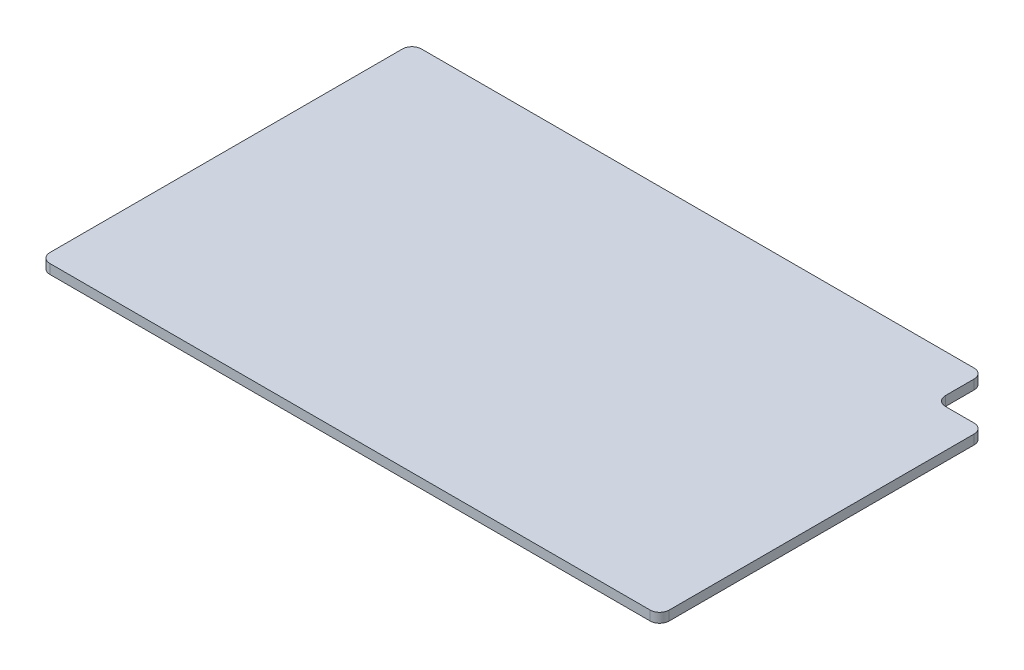
ISO-10303-21;
HEADER;
FILE_DESCRIPTION(('STEP AP214'),'2;1');
FILE_NAME('part.step','',(''),(''),'','','');
FILE_SCHEMA(('AUTOMOTIVE_DESIGN { 1 0 10303 214 1 1 1 1 }'));
ENDSEC;
DATA;
#1=APPLICATION_CONTEXT('core data for automotive mechanical design processes');
#2=APPLICATION_PROTOCOL_DEFINITION('international standard','automotive_design',2000,#1);
#3=PRODUCT_CONTEXT('',#1,'mechanical');
#4=PRODUCT('Part','Part','',(#3));
#5=PRODUCT_RELATED_PRODUCT_CATEGORY('part','',(#4));
#6=PRODUCT_DEFINITION_FORMATION('','',#4);
#7=PRODUCT_DEFINITION_CONTEXT('part definition',#1,'design');
#8=PRODUCT_DEFINITION('design','',#6,#7);
#9=PRODUCT_DEFINITION_SHAPE('','',#8);
#10=(LENGTH_UNIT() NAMED_UNIT(*) SI_UNIT(.MILLI.,.METRE.));
#11=(NAMED_UNIT(*) PLANE_ANGLE_UNIT() SI_UNIT($,.RADIAN.));
#12=(NAMED_UNIT(*) SI_UNIT($,.STERADIAN.) SOLID_ANGLE_UNIT());
#13=UNCERTAINTY_MEASURE_WITH_UNIT(LENGTH_MEASURE(1.E-05),#10,'distance_accuracy_value','');
#14=(GEOMETRIC_REPRESENTATION_CONTEXT(3) GLOBAL_UNCERTAINTY_ASSIGNED_CONTEXT((#13)) GLOBAL_UNIT_ASSIGNED_CONTEXT((#10,
#11,#12)) REPRESENTATION_CONTEXT('',''));
#15=CARTESIAN_POINT('',(0.,0.,0.));
#16=DIRECTION('',(0.,0.,1.));
#17=DIRECTION('',(1.,0.,0.));
#18=AXIS2_PLACEMENT_3D('',#15,#16,#17);
#19=CARTESIAN_POINT('',(20.8916831414113,5.48934040957227,79.2905391030123));
#20=DIRECTION('',(0.,0.,-1.));
#21=DIRECTION('',(-1.,0.,0.));
#22=AXIS2_PLACEMENT_3D('',#19,#20,#21);
#23=PLANE('',#22);
#24=DIRECTION('',(1.,0.,0.));
#25=VECTOR('',#24,1.);
#26=CARTESIAN_POINT('',(20.8916831414113,5.48934040957227,79.2905391030123));
#27=LINE('',#26,#25);
#28=CARTESIAN_POINT('',(-43.1083168585887,5.48934040957227,79.2905391030123));
#29=VERTEX_POINT('',#28);
#30=CARTESIAN_POINT('',(19.8916831414113,5.48934040957227,79.2905391030123));
#31=VERTEX_POINT('',#30);
#32=EDGE_CURVE('E172',#29,#31,#27,.T.);
#33=ORIENTED_EDGE('',*,*,#32,.F.);
#34=DIRECTION('',(0.,-1.,0.));
#35=VECTOR('',#34,1.);
#36=CARTESIAN_POINT('',(-43.1083168585887,5.48934040957227,79.2905391030123));
#37=LINE('',#36,#35);
#38=CARTESIAN_POINT('',(-43.1083168585887,4.48934040957227,79.2905391030123));
#39=VERTEX_POINT('',#38);
#40=EDGE_CURVE('E212',#29,#39,#37,.T.);
#41=ORIENTED_EDGE('',*,*,#40,.T.);
#42=DIRECTION('',(1.,0.,0.));
#43=VECTOR('',#42,1.);
#44=CARTESIAN_POINT('',(20.8916831414113,4.48934040957227,79.2905391030123));
#45=LINE('',#44,#43);
#46=CARTESIAN_POINT('',(19.8916831414113,4.48934040957227,79.2905391030123));
#47=VERTEX_POINT('',#46);
#48=EDGE_CURVE('E158',#39,#47,#45,.T.);
#49=ORIENTED_EDGE('',*,*,#48,.T.);
#50=DIRECTION('',(0.,-1.,0.));
#51=VECTOR('',#50,1.);
#52=CARTESIAN_POINT('',(19.8916831414113,5.48934040957227,79.2905391030123));
#53=LINE('',#52,#51);
#54=EDGE_CURVE('E141',#47,#31,#53,.F.);
#55=ORIENTED_EDGE('',*,*,#54,.T.);
#56=EDGE_LOOP('',(#33,#41,#49,#55));
#57=FACE_BOUND('',#56,.T.);
#58=ADVANCED_FACE('F45',(#57),#23,.F.);
#59=CARTESIAN_POINT('',(20.8916831414113,5.48934040957227,45.2905391030123));
#60=DIRECTION('',(-1.,0.,0.));
#61=DIRECTION('',(0.,0.,1.));
#62=AXIS2_PLACEMENT_3D('',#59,#60,#61);
#63=PLANE('',#62);
#64=DIRECTION('',(0.,0.,-1.));
#65=VECTOR('',#64,1.);
#66=CARTESIAN_POINT('',(20.8916831414113,4.48934040957227,45.2905391030123));
#67=LINE('',#66,#65);
#68=CARTESIAN_POINT('',(20.8916831414113,4.48934040957227,78.2905391030123));
#69=VERTEX_POINT('',#68);
#70=CARTESIAN_POINT('',(20.8916831414113,4.48934040957227,46.2905391030123));
#71=VERTEX_POINT('',#70);
#72=EDGE_CURVE('E148',#69,#71,#67,.T.);
#73=ORIENTED_EDGE('',*,*,#72,.T.);
#74=DIRECTION('',(0.,-1.,0.));
#75=VECTOR('',#74,1.);
#76=CARTESIAN_POINT('',(20.8916831414113,5.48934040957227,46.2905391030123));
#77=LINE('',#76,#75);
#78=CARTESIAN_POINT('',(20.8916831414113,5.48934040957227,46.2905391030123));
#79=VERTEX_POINT('',#78);
#80=EDGE_CURVE('E197',#71,#79,#77,.F.);
#81=ORIENTED_EDGE('',*,*,#80,.T.);
#82=DIRECTION('',(0.,0.,-1.));
#83=VECTOR('',#82,1.);
#84=CARTESIAN_POINT('',(20.8916831414113,5.48934040957227,45.2905391030123));
#85=LINE('',#84,#83);
#86=CARTESIAN_POINT('',(20.8916831414113,5.48934040957227,78.2905391030123));
#87=VERTEX_POINT('',#86);
#88=EDGE_CURVE('E151',#87,#79,#85,.T.);
#89=ORIENTED_EDGE('',*,*,#88,.F.);
#90=DIRECTION('',(0.,-1.,0.));
#91=VECTOR('',#90,1.);
#92=CARTESIAN_POINT('',(20.8916831414113,5.48934040957227,78.2905391030123));
#93=LINE('',#92,#91);
#94=EDGE_CURVE('E139',#87,#69,#93,.T.);
#95=ORIENTED_EDGE('',*,*,#94,.T.);
#96=EDGE_LOOP('',(#73,#81,#89,#95));
#97=FACE_BOUND('',#96,.T.);
#98=ADVANCED_FACE('F147',(#97),#63,.F.);
#99=CARTESIAN_POINT('',(15.8916831414113,5.48934040957227,45.2905391030123));
#100=DIRECTION('',(0.,0.,1.));
#101=DIRECTION('',(1.,0.,0.));
#102=AXIS2_PLACEMENT_3D('',#99,#100,#101);
#103=PLANE('',#102);
#104=DIRECTION('',(-1.,0.,0.));
#105=VECTOR('',#104,1.);
#106=CARTESIAN_POINT('',(15.8916831414113,4.48934040957227,45.2905391030123));
#107=LINE('',#106,#105);
#108=CARTESIAN_POINT('',(19.8916831414113,4.48934040957227,45.2905391030123));
#109=VERTEX_POINT('',#108);
#110=CARTESIAN_POINT('',(16.8916831414113,4.48934040957227,45.2905391030123));
#111=VERTEX_POINT('',#110);
#112=EDGE_CURVE('E157',#109,#111,#107,.T.);
#113=ORIENTED_EDGE('',*,*,#112,.T.);
#114=DIRECTION('',(0.,-1.,0.));
#115=VECTOR('',#114,1.);
#116=CARTESIAN_POINT('',(16.8916831414113,5.48934040957227,45.2905391030123));
#117=LINE('',#116,#115);
#118=CARTESIAN_POINT('',(16.8916831414113,5.48934040957227,45.2905391030123));
#119=VERTEX_POINT('',#118);
#120=EDGE_CURVE('E195',#111,#119,#117,.F.);
#121=ORIENTED_EDGE('',*,*,#120,.T.);
#122=DIRECTION('',(-1.,0.,0.));
#123=VECTOR('',#122,1.);
#124=CARTESIAN_POINT('',(15.8916831414113,5.48934040957227,45.2905391030123));
#125=LINE('',#124,#123);
#126=CARTESIAN_POINT('',(19.8916831414113,5.48934040957227,45.2905391030123));
#127=VERTEX_POINT('',#126);
#128=EDGE_CURVE('E231',#127,#119,#125,.T.);
#129=ORIENTED_EDGE('',*,*,#128,.F.);
#130=DIRECTION('',(0.,-1.,0.));
#131=VECTOR('',#130,1.);
#132=CARTESIAN_POINT('',(19.8916831414113,5.48934040957227,45.2905391030123));
#133=LINE('',#132,#131);
#134=EDGE_CURVE('E192',#127,#109,#133,.T.);
#135=ORIENTED_EDGE('',*,*,#134,.T.);
#136=EDGE_LOOP('',(#113,#121,#129,#135));
#137=FACE_BOUND('',#136,.T.);
#138=ADVANCED_FACE('F241',(#137),#103,.F.);
#139=CARTESIAN_POINT('',(15.8916831414113,5.48934040957227,40.2905391030123));
#140=DIRECTION('',(-1.,0.,0.));
#141=DIRECTION('',(0.,0.,1.));
#142=AXIS2_PLACEMENT_3D('',#139,#140,#141);
#143=PLANE('',#142);
#144=DIRECTION('',(0.,0.,-1.));
#145=VECTOR('',#144,1.);
#146=CARTESIAN_POINT('',(15.8916831414113,4.48934040957227,40.2905391030123));
#147=LINE('',#146,#145);
#148=CARTESIAN_POINT('',(15.8916831414113,4.48934040957227,44.2905391030123));
#149=VERTEX_POINT('',#148);
#150=CARTESIAN_POINT('',(15.8916831414113,4.48934040957227,41.2905391030123));
#151=VERTEX_POINT('',#150);
#152=EDGE_CURVE('E161',#149,#151,#147,.T.);
#153=ORIENTED_EDGE('',*,*,#152,.T.);
#154=DIRECTION('',(0.,-1.,0.));
#155=VECTOR('',#154,1.);
#156=CARTESIAN_POINT('',(15.8916831414113,5.48934040957227,41.2905391030123));
#157=LINE('',#156,#155);
#158=CARTESIAN_POINT('',(15.8916831414113,5.48934040957227,41.2905391030123));
#159=VERTEX_POINT('',#158);
#160=EDGE_CURVE('E186',#151,#159,#157,.F.);
#161=ORIENTED_EDGE('',*,*,#160,.T.);
#162=DIRECTION('',(0.,0.,-1.));
#163=VECTOR('',#162,1.);
#164=CARTESIAN_POINT('',(15.8916831414113,5.48934040957227,40.2905391030123));
#165=LINE('',#164,#163);
#166=CARTESIAN_POINT('',(15.8916831414113,5.48934040957227,44.2905391030123));
#167=VERTEX_POINT('',#166);
#168=EDGE_CURVE('E226',#167,#159,#165,.T.);
#169=ORIENTED_EDGE('',*,*,#168,.F.);
#170=DIRECTION('',(0.,-1.,0.));
#171=VECTOR('',#170,1.);
#172=CARTESIAN_POINT('',(15.8916831414113,4.48934040957227,44.2905391030123));
#173=LINE('',#172,#171);
#174=EDGE_CURVE('E183',#167,#149,#173,.T.);
#175=ORIENTED_EDGE('',*,*,#174,.T.);
#176=EDGE_LOOP('',(#153,#161,#169,#175));
#177=FACE_BOUND('',#176,.T.);
#178=ADVANCED_FACE('F250',(#177),#143,.F.);
#179=CARTESIAN_POINT('',(-44.1083168585887,5.48934040957227,40.2905391030123));
#180=DIRECTION('',(0.,0.,1.));
#181=DIRECTION('',(1.,0.,0.));
#182=AXIS2_PLACEMENT_3D('',#179,#180,#181);
#183=PLANE('',#182);
#184=DIRECTION('',(-1.,0.,0.));
#185=VECTOR('',#184,1.);
#186=CARTESIAN_POINT('',(-44.1083168585887,4.48934040957227,40.2905391030123));
#187=LINE('',#186,#185);
#188=CARTESIAN_POINT('',(14.8916831414113,4.48934040957227,40.2905391030123));
#189=VERTEX_POINT('',#188);
#190=CARTESIAN_POINT('',(-43.1083168585887,4.48934040957227,40.2905391030123));
#191=VERTEX_POINT('',#190);
#192=EDGE_CURVE('E168',#189,#191,#187,.T.);
#193=ORIENTED_EDGE('',*,*,#192,.T.);
#194=DIRECTION('',(0.,-1.,0.));
#195=VECTOR('',#194,1.);
#196=CARTESIAN_POINT('',(-43.1083168585887,5.48934040957227,40.2905391030123));
#197=LINE('',#196,#195);
#198=CARTESIAN_POINT('',(-43.1083168585887,5.48934040957227,40.2905391030123));
#199=VERTEX_POINT('',#198);
#200=EDGE_CURVE('E208',#191,#199,#197,.F.);
#201=ORIENTED_EDGE('',*,*,#200,.T.);
#202=DIRECTION('',(-1.,0.,0.));
#203=VECTOR('',#202,1.);
#204=CARTESIAN_POINT('',(-44.1083168585887,5.48934040957227,40.2905391030123));
#205=LINE('',#204,#203);
#206=CARTESIAN_POINT('',(14.8916831414113,5.48934040957227,40.2905391030123));
#207=VERTEX_POINT('',#206);
#208=EDGE_CURVE('E225',#207,#199,#205,.T.);
#209=ORIENTED_EDGE('',*,*,#208,.F.);
#210=DIRECTION('',(0.,-1.,0.));
#211=VECTOR('',#210,1.);
#212=CARTESIAN_POINT('',(14.8916831414113,5.48934040957227,40.2905391030123));
#213=LINE('',#212,#211);
#214=EDGE_CURVE('E177',#207,#189,#213,.T.);
#215=ORIENTED_EDGE('',*,*,#214,.T.);
#216=EDGE_LOOP('',(#193,#201,#209,#215));
#217=FACE_BOUND('',#216,.T.);
#218=ADVANCED_FACE('F259',(#217),#183,.F.);
#219=CARTESIAN_POINT('',(-44.1083168585887,5.48934040957227,79.2905391030123));
#220=DIRECTION('',(1.,0.,0.));
#221=DIRECTION('',(0.,0.,-1.));
#222=AXIS2_PLACEMENT_3D('',#219,#220,#221);
#223=PLANE('',#222);
#224=DIRECTION('',(0.,0.,1.));
#225=VECTOR('',#224,1.);
#226=CARTESIAN_POINT('',(-44.1083168585887,4.48934040957227,79.2905391030123));
#227=LINE('',#226,#225);
#228=CARTESIAN_POINT('',(-44.1083168585887,4.48934040957227,41.2905391030123));
#229=VERTEX_POINT('',#228);
#230=CARTESIAN_POINT('',(-44.1083168585887,4.48934040957227,78.2905391030123));
#231=VERTEX_POINT('',#230);
#232=EDGE_CURVE('E171',#229,#231,#227,.T.);
#233=ORIENTED_EDGE('',*,*,#232,.T.);
#234=DIRECTION('',(0.,-1.,0.));
#235=VECTOR('',#234,1.);
#236=CARTESIAN_POINT('',(-44.1083168585887,5.48934040957227,78.2905391030123));
#237=LINE('',#236,#235);
#238=CARTESIAN_POINT('',(-44.1083168585887,5.48934040957227,78.2905391030123));
#239=VERTEX_POINT('',#238);
#240=EDGE_CURVE('E53',#231,#239,#237,.F.);
#241=ORIENTED_EDGE('',*,*,#240,.T.);
#242=DIRECTION('',(0.,0.,1.));
#243=VECTOR('',#242,1.);
#244=CARTESIAN_POINT('',(-44.1083168585887,5.48934040957227,79.2905391030123));
#245=LINE('',#244,#243);
#246=CARTESIAN_POINT('',(-44.1083168585887,5.48934040957227,41.2905391030123));
#247=VERTEX_POINT('',#246);
#248=EDGE_CURVE('E152',#247,#239,#245,.T.);
#249=ORIENTED_EDGE('',*,*,#248,.F.);
#250=DIRECTION('',(0.,-1.,0.));
#251=VECTOR('',#250,1.);
#252=CARTESIAN_POINT('',(-44.1083168585887,5.48934040957227,41.2905391030123));
#253=LINE('',#252,#251);
#254=EDGE_CURVE('E203',#247,#229,#253,.T.);
#255=ORIENTED_EDGE('',*,*,#254,.T.);
#256=EDGE_LOOP('',(#233,#241,#249,#255));
#257=FACE_BOUND('',#256,.T.);
#258=ADVANCED_FACE('F263',(#257),#223,.F.);
#259=CARTESIAN_POINT('',(14.2625440685636,5.48934040957227,58.8865655930786));
#260=DIRECTION('',(0.,-1.,0.));
#261=DIRECTION('',(0.,0.,-1.));
#262=AXIS2_PLACEMENT_3D('',#259,#260,#261);
#263=PLANE('',#262);
#264=ORIENTED_EDGE('',*,*,#248,.T.);
#265=CARTESIAN_POINT('',(-43.1083168585887,5.48934040957227,78.2905391030123));
#266=DIRECTION('',(0.,-1.,0.));
#267=DIRECTION('',(0.,0.,-1.));
#268=AXIS2_PLACEMENT_3D('',#265,#266,#267);
#269=CIRCLE('',#268,1.);
#270=EDGE_CURVE('E11',#239,#29,#269,.F.);
#271=ORIENTED_EDGE('',*,*,#270,.T.);
#272=ORIENTED_EDGE('',*,*,#32,.T.);
#273=CARTESIAN_POINT('',(19.8916831414113,5.48934040957227,78.2905391030123));
#274=DIRECTION('',(0.,-1.,0.));
#275=DIRECTION('',(0.,0.,-1.));
#276=AXIS2_PLACEMENT_3D('',#273,#274,#275);
#277=CIRCLE('',#276,1.);
#278=EDGE_CURVE('E175',#31,#87,#277,.F.);
#279=ORIENTED_EDGE('',*,*,#278,.T.);
#280=ORIENTED_EDGE('',*,*,#88,.T.);
#281=CARTESIAN_POINT('',(19.8916831414113,5.48934040957227,46.2905391030123));
#282=DIRECTION('',(0.,-1.,0.));
#283=DIRECTION('',(0.,0.,-1.));
#284=AXIS2_PLACEMENT_3D('',#281,#282,#283);
#285=CIRCLE('',#284,1.);
#286=EDGE_CURVE('E188',#79,#127,#285,.F.);
#287=ORIENTED_EDGE('',*,*,#286,.T.);
#288=ORIENTED_EDGE('',*,*,#128,.T.);
#289=CARTESIAN_POINT('',(16.8916831414113,5.48934040957227,44.2905391030123));
#290=DIRECTION('',(0.,-1.,0.));
#291=DIRECTION('',(0.,0.,-1.));
#292=AXIS2_PLACEMENT_3D('',#289,#290,#291);
#293=CIRCLE('',#292,1.);
#294=EDGE_CURVE('E201',#119,#167,#293,.T.);
#295=ORIENTED_EDGE('',*,*,#294,.T.);
#296=ORIENTED_EDGE('',*,*,#168,.T.);
#297=CARTESIAN_POINT('',(14.8916831414113,5.48934040957227,41.2905391030123));
#298=DIRECTION('',(0.,-1.,0.));
#299=DIRECTION('',(0.,0.,-1.));
#300=AXIS2_PLACEMENT_3D('',#297,#298,#299);
#301=CIRCLE('',#300,1.);
#302=EDGE_CURVE('E190',#159,#207,#301,.F.);
#303=ORIENTED_EDGE('',*,*,#302,.T.);
#304=ORIENTED_EDGE('',*,*,#208,.T.);
#305=CARTESIAN_POINT('',(-43.1083168585887,5.48934040957227,41.2905391030123));
#306=DIRECTION('',(0.,-1.,0.));
#307=DIRECTION('',(0.,0.,-1.));
#308=AXIS2_PLACEMENT_3D('',#305,#306,#307);
#309=CIRCLE('',#308,1.);
#310=EDGE_CURVE('E210',#199,#247,#309,.F.);
#311=ORIENTED_EDGE('',*,*,#310,.T.);
#312=EDGE_LOOP('',(#264,#271,#272,#279,#280,#287,#288,#295,#296,#303,#304,#311));
#313=FACE_BOUND('',#312,.T.);
#314=ADVANCED_FACE('F221',(#313),#263,.F.);
#315=CARTESIAN_POINT('',(14.2625440685636,4.48934040957227,58.8865655930786));
#316=DIRECTION('',(0.,-1.,0.));
#317=DIRECTION('',(0.,0.,-1.));
#318=AXIS2_PLACEMENT_3D('',#315,#316,#317);
#319=PLANE('',#318);
#320=ORIENTED_EDGE('',*,*,#48,.F.);
#321=CARTESIAN_POINT('',(-43.1083168585887,4.48934040957227,78.2905391030123));
#322=DIRECTION('',(0.,-1.,0.));
#323=DIRECTION('',(0.,0.,-1.));
#324=AXIS2_PLACEMENT_3D('',#321,#322,#323);
#325=CIRCLE('',#324,1.);
#326=EDGE_CURVE('E67',#39,#231,#325,.T.);
#327=ORIENTED_EDGE('',*,*,#326,.T.);
#328=ORIENTED_EDGE('',*,*,#232,.F.);
#329=CARTESIAN_POINT('',(-43.1083168585887,4.48934040957227,41.2905391030123));
#330=DIRECTION('',(0.,-1.,0.));
#331=DIRECTION('',(0.,0.,-1.));
#332=AXIS2_PLACEMENT_3D('',#329,#330,#331);
#333=CIRCLE('',#332,1.);
#334=EDGE_CURVE('E206',#229,#191,#333,.T.);
#335=ORIENTED_EDGE('',*,*,#334,.T.);
#336=ORIENTED_EDGE('',*,*,#192,.F.);
#337=CARTESIAN_POINT('',(14.8916831414113,4.48934040957227,41.2905391030123));
#338=DIRECTION('',(0.,-1.,0.));
#339=DIRECTION('',(0.,0.,-1.));
#340=AXIS2_PLACEMENT_3D('',#337,#338,#339);
#341=CIRCLE('',#340,1.);
#342=EDGE_CURVE('E181',#189,#151,#341,.T.);
#343=ORIENTED_EDGE('',*,*,#342,.T.);
#344=ORIENTED_EDGE('',*,*,#152,.F.);
#345=CARTESIAN_POINT('',(16.8916831414113,4.48934040957227,44.2905391030123));
#346=DIRECTION('',(0.,-1.,0.));
#347=DIRECTION('',(0.,0.,-1.));
#348=AXIS2_PLACEMENT_3D('',#345,#346,#347);
#349=CIRCLE('',#348,1.);
#350=EDGE_CURVE('E199',#149,#111,#349,.F.);
#351=ORIENTED_EDGE('',*,*,#350,.T.);
#352=ORIENTED_EDGE('',*,*,#112,.F.);
#353=CARTESIAN_POINT('',(19.8916831414113,4.48934040957227,46.2905391030123));
#354=DIRECTION('',(0.,-1.,0.));
#355=DIRECTION('',(0.,0.,-1.));
#356=AXIS2_PLACEMENT_3D('',#353,#354,#355);
#357=CIRCLE('',#356,1.);
#358=EDGE_CURVE('E156',#109,#71,#357,.T.);
#359=ORIENTED_EDGE('',*,*,#358,.T.);
#360=ORIENTED_EDGE('',*,*,#72,.F.);
#361=CARTESIAN_POINT('',(19.8916831414113,4.48934040957227,78.2905391030123));
#362=DIRECTION('',(0.,-1.,0.));
#363=DIRECTION('',(0.,0.,-1.));
#364=AXIS2_PLACEMENT_3D('',#361,#362,#363);
#365=CIRCLE('',#364,1.);
#366=EDGE_CURVE('E135',#69,#47,#365,.T.);
#367=ORIENTED_EDGE('',*,*,#366,.T.);
#368=EDGE_LOOP('',(#320,#327,#328,#335,#336,#343,#344,#351,#352,#359,#360,#367));
#369=FACE_BOUND('',#368,.T.);
#370=ADVANCED_FACE('F154',(#369),#319,.T.);
#371=CARTESIAN_POINT('',(19.8916831414113,5.48934040957227,78.2905391030123));
#372=DIRECTION('',(0.,-1.,0.));
#373=DIRECTION('',(0.,0.,-1.));
#374=AXIS2_PLACEMENT_3D('',#371,#372,#373);
#375=CYLINDRICAL_SURFACE('',#374,1.);
#376=ORIENTED_EDGE('',*,*,#278,.F.);
#377=ORIENTED_EDGE('',*,*,#54,.F.);
#378=ORIENTED_EDGE('',*,*,#366,.F.);
#379=ORIENTED_EDGE('',*,*,#94,.F.);
#380=EDGE_LOOP('',(#376,#377,#378,#379));
#381=FACE_BOUND('',#380,.T.);
#382=ADVANCED_FACE('F138',(#381),#375,.T.);
#383=CARTESIAN_POINT('',(14.8916831414113,5.48934040957227,41.2905391030123));
#384=DIRECTION('',(0.,-1.,0.));
#385=DIRECTION('',(0.,0.,-1.));
#386=AXIS2_PLACEMENT_3D('',#383,#384,#385);
#387=CYLINDRICAL_SURFACE('',#386,1.);
#388=ORIENTED_EDGE('',*,*,#302,.F.);
#389=ORIENTED_EDGE('',*,*,#160,.F.);
#390=ORIENTED_EDGE('',*,*,#342,.F.);
#391=ORIENTED_EDGE('',*,*,#214,.F.);
#392=EDGE_LOOP('',(#388,#389,#390,#391));
#393=FACE_BOUND('',#392,.T.);
#394=ADVANCED_FACE('F256',(#393),#387,.T.);
#395=CARTESIAN_POINT('',(16.8916831414113,5.48934040957227,44.2905391030123));
#396=DIRECTION('',(0.,1.,0.));
#397=DIRECTION('',(0.,0.,1.));
#398=AXIS2_PLACEMENT_3D('',#395,#396,#397);
#399=CYLINDRICAL_SURFACE('',#398,1.);
#400=ORIENTED_EDGE('',*,*,#294,.F.);
#401=ORIENTED_EDGE('',*,*,#120,.F.);
#402=ORIENTED_EDGE('',*,*,#350,.F.);
#403=ORIENTED_EDGE('',*,*,#174,.F.);
#404=EDGE_LOOP('',(#400,#401,#402,#403));
#405=FACE_BOUND('',#404,.T.);
#406=ADVANCED_FACE('F247',(#405),#399,.F.);
#407=CARTESIAN_POINT('',(19.8916831414113,5.48934040957227,46.2905391030123));
#408=DIRECTION('',(0.,-1.,0.));
#409=DIRECTION('',(0.,0.,-1.));
#410=AXIS2_PLACEMENT_3D('',#407,#408,#409);
#411=CYLINDRICAL_SURFACE('',#410,1.);
#412=ORIENTED_EDGE('',*,*,#286,.F.);
#413=ORIENTED_EDGE('',*,*,#80,.F.);
#414=ORIENTED_EDGE('',*,*,#358,.F.);
#415=ORIENTED_EDGE('',*,*,#134,.F.);
#416=EDGE_LOOP('',(#412,#413,#414,#415));
#417=FACE_BOUND('',#416,.T.);
#418=ADVANCED_FACE('F239',(#417),#411,.T.);
#419=CARTESIAN_POINT('',(-43.1083168585887,5.48934040957227,41.2905391030123));
#420=DIRECTION('',(0.,-1.,0.));
#421=DIRECTION('',(0.,0.,-1.));
#422=AXIS2_PLACEMENT_3D('',#419,#420,#421);
#423=CYLINDRICAL_SURFACE('',#422,1.);
#424=ORIENTED_EDGE('',*,*,#310,.F.);
#425=ORIENTED_EDGE('',*,*,#200,.F.);
#426=ORIENTED_EDGE('',*,*,#334,.F.);
#427=ORIENTED_EDGE('',*,*,#254,.F.);
#428=EDGE_LOOP('',(#424,#425,#426,#427));
#429=FACE_BOUND('',#428,.T.);
#430=ADVANCED_FACE('F262',(#429),#423,.T.);
#431=CARTESIAN_POINT('',(-43.1083168585887,5.48934040957227,78.2905391030123));
#432=DIRECTION('',(0.,-1.,0.));
#433=DIRECTION('',(0.,0.,-1.));
#434=AXIS2_PLACEMENT_3D('',#431,#432,#433);
#435=CYLINDRICAL_SURFACE('',#434,1.);
#436=ORIENTED_EDGE('',*,*,#270,.F.);
#437=ORIENTED_EDGE('',*,*,#240,.F.);
#438=ORIENTED_EDGE('',*,*,#326,.F.);
#439=ORIENTED_EDGE('',*,*,#40,.F.);
#440=EDGE_LOOP('',(#436,#437,#438,#439));
#441=FACE_BOUND('',#440,.T.);
#442=ADVANCED_FACE('F47',(#441),#435,.T.);
#443=CLOSED_SHELL('',(#58,#98,#138,#178,#218,#258,#314,#370,#382,#394,#406,#418,#430,#442));
#444=MANIFOLD_SOLID_BREP('B2',#443);
#445=ADVANCED_BREP_SHAPE_REPRESENTATION('',(#18,#444),#14);
#446=SHAPE_DEFINITION_REPRESENTATION(#9,#445);
ENDSEC;
END-ISO-10303-21;
